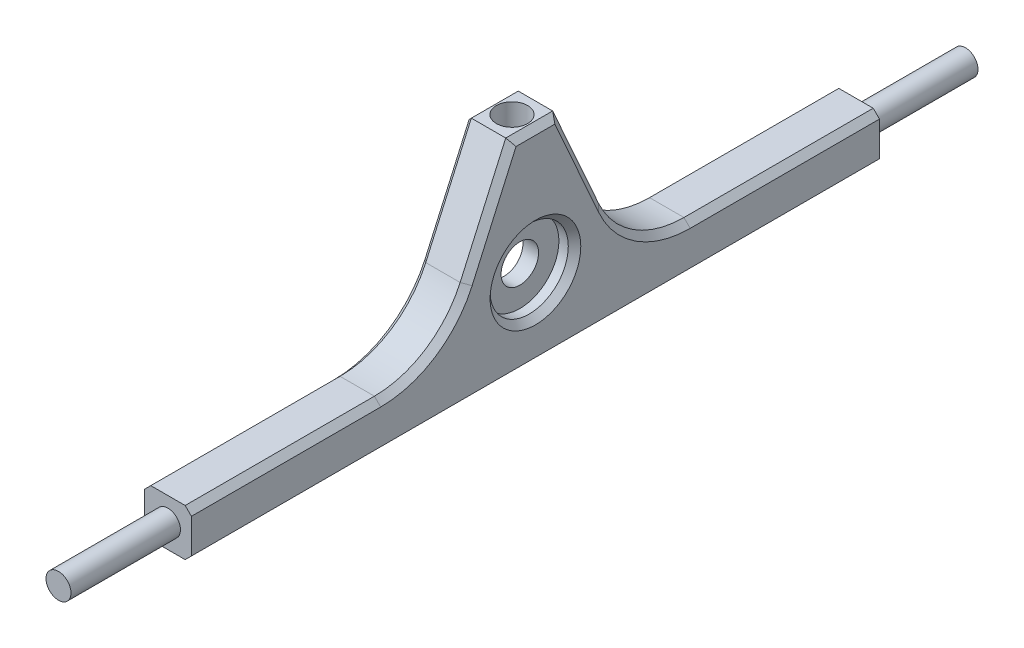
ISO-10303-21;
HEADER;
FILE_DESCRIPTION(('STEP AP214'),'2;1');
FILE_NAME('part.step','',(''),(''),'','','');
FILE_SCHEMA(('AUTOMOTIVE_DESIGN { 1 0 10303 214 1 1 1 1 }'));
ENDSEC;
DATA;
#1=APPLICATION_CONTEXT('core data for automotive mechanical design processes');
#2=APPLICATION_PROTOCOL_DEFINITION('international standard','automotive_design',2000,#1);
#3=PRODUCT_CONTEXT('',#1,'mechanical');
#4=PRODUCT('Part','Part','',(#3));
#5=PRODUCT_RELATED_PRODUCT_CATEGORY('part','',(#4));
#6=PRODUCT_DEFINITION_FORMATION('','',#4);
#7=PRODUCT_DEFINITION_CONTEXT('part definition',#1,'design');
#8=PRODUCT_DEFINITION('design','',#6,#7);
#9=PRODUCT_DEFINITION_SHAPE('','',#8);
#10=(LENGTH_UNIT() NAMED_UNIT(*) SI_UNIT(.MILLI.,.METRE.));
#11=(NAMED_UNIT(*) PLANE_ANGLE_UNIT() SI_UNIT($,.RADIAN.));
#12=(NAMED_UNIT(*) SI_UNIT($,.STERADIAN.) SOLID_ANGLE_UNIT());
#13=UNCERTAINTY_MEASURE_WITH_UNIT(LENGTH_MEASURE(1.E-05),#10,'distance_accuracy_value','');
#14=(GEOMETRIC_REPRESENTATION_CONTEXT(3) GLOBAL_UNCERTAINTY_ASSIGNED_CONTEXT((#13)) GLOBAL_UNIT_ASSIGNED_CONTEXT((#10,
#11,#12)) REPRESENTATION_CONTEXT('',''));
#15=CARTESIAN_POINT('',(0.,0.,0.));
#16=DIRECTION('',(0.,0.,1.));
#17=DIRECTION('',(1.,0.,0.));
#18=AXIS2_PLACEMENT_3D('',#15,#16,#17);
#19=CARTESIAN_POINT('',(-7.50005,18.,0.));
#20=DIRECTION('',(1.,0.,0.));
#21=DIRECTION('',(0.,0.,-1.));
#22=AXIS2_PLACEMENT_3D('',#19,#20,#21);
#23=CYLINDRICAL_SURFACE('',#22,6.);
#24=CARTESIAN_POINT('',(2.5,18.,0.));
#25=DIRECTION('',(1.,0.,0.));
#26=DIRECTION('',(0.,0.,-1.));
#27=AXIS2_PLACEMENT_3D('',#24,#25,#26);
#28=CIRCLE('',#27,6.);
#29=CARTESIAN_POINT('',(2.5,18.,-6.));
#30=VERTEX_POINT('',#29);
#31=EDGE_CURVE('E354',#30,#30,#28,.F.);
#32=ORIENTED_EDGE('',*,*,#31,.F.);
#33=EDGE_LOOP('',(#32));
#34=FACE_BOUND('',#33,.T.);
#35=CARTESIAN_POINT('',(-2.5,18.,0.));
#36=DIRECTION('',(-1.,0.,0.));
#37=DIRECTION('',(0.,0.,1.));
#38=AXIS2_PLACEMENT_3D('',#35,#36,#37);
#39=CIRCLE('',#38,6.);
#40=CARTESIAN_POINT('',(-2.5,18.,6.));
#41=VERTEX_POINT('',#40);
#42=EDGE_CURVE('E359',#41,#41,#39,.F.);
#43=ORIENTED_EDGE('',*,*,#42,.F.);
#44=EDGE_LOOP('',(#43));
#45=FACE_BOUND('',#44,.T.);
#46=ADVANCED_FACE('F45',(#34,#45),#23,.F.);
#47=CARTESIAN_POINT('',(-7.5,-7.5,-110.));
#48=DIRECTION('',(-1.,0.,0.));
#49=DIRECTION('',(0.,0.,1.));
#50=AXIS2_PLACEMENT_3D('',#47,#48,#49);
#51=PLANE('',#50);
#52=CARTESIAN_POINT('',(-7.5,18.,0.));
#53=DIRECTION('',(-1.,0.,0.));
#54=DIRECTION('',(0.,0.,1.));
#55=AXIS2_PLACEMENT_3D('',#52,#53,#54);
#56=CIRCLE('',#55,14.5);
#57=CARTESIAN_POINT('',(-7.5,18.,14.5));
#58=VERTEX_POINT('',#57);
#59=EDGE_CURVE('E236',#58,#58,#56,.F.);
#60=ORIENTED_EDGE('',*,*,#59,.T.);
#61=EDGE_LOOP('',(#60));
#62=FACE_BOUND('',#61,.T.);
#63=DIRECTION('',(0.,-1.,0.));
#64=VECTOR('',#63,1.);
#65=CARTESIAN_POINT('',(-7.5,-7.5,-110.));
#66=LINE('',#65,#64);
#67=CARTESIAN_POINT('',(-7.5,5.49999999999999,-110.));
#68=VERTEX_POINT('',#67);
#69=CARTESIAN_POINT('',(-7.5,-5.50000000000003,-110.));
#70=VERTEX_POINT('',#69);
#71=EDGE_CURVE('E331',#68,#70,#66,.T.);
#72=ORIENTED_EDGE('',*,*,#71,.T.);
#73=DIRECTION('',(0.,0.,1.));
#74=VECTOR('',#73,1.);
#75=CARTESIAN_POINT('',(-7.5,-5.50000000000003,-110.));
#76=LINE('',#75,#74);
#77=CARTESIAN_POINT('',(-7.5,-5.50000000000003,110.));
#78=VERTEX_POINT('',#77);
#79=EDGE_CURVE('E233',#70,#78,#76,.T.);
#80=ORIENTED_EDGE('',*,*,#79,.T.);
#81=DIRECTION('',(0.,-1.,0.));
#82=VECTOR('',#81,1.);
#83=CARTESIAN_POINT('',(-7.5,-7.5,110.));
#84=LINE('',#83,#82);
#85=CARTESIAN_POINT('',(-7.5,5.50000000000007,110.));
#86=VERTEX_POINT('',#85);
#87=EDGE_CURVE('E452',#86,#78,#84,.T.);
#88=ORIENTED_EDGE('',*,*,#87,.F.);
#89=DIRECTION('',(0.,0.,-1.));
#90=VECTOR('',#89,1.);
#91=CARTESIAN_POINT('',(-7.5,5.50000000000007,-110.));
#92=LINE('',#91,#90);
#93=CARTESIAN_POINT('',(-7.5,5.50000000000008,49.4766071291057));
#94=VERTEX_POINT('',#93);
#95=EDGE_CURVE('E231',#86,#94,#92,.T.);
#96=ORIENTED_EDGE('',*,*,#95,.T.);
#97=CARTESIAN_POINT('',(-7.5,37.5,49.4766071291057));
#98=DIRECTION('',(-1.,0.,0.));
#99=DIRECTION('',(0.,0.,1.));
#100=AXIS2_PLACEMENT_3D('',#97,#98,#99);
#101=CIRCLE('',#100,31.9999999999999);
#102=CARTESIAN_POINT('',(-7.5,24.4767224470878,20.246584177014));
#103=VERTEX_POINT('',#102);
#104=EDGE_CURVE('E229',#94,#103,#101,.F.);
#105=ORIENTED_EDGE('',*,*,#104,.T.);
#106=DIRECTION('',(0.,0.913438217252869,-0.406977423528506));
#107=VECTOR('',#106,1.);
#108=CARTESIAN_POINT('',(-7.5,46.2153270112777,10.5610672919789));
#109=LINE('',#108,#107);
#110=CARTESIAN_POINT('',(-7.5,56.,6.20155952472637));
#111=VERTEX_POINT('',#110);
#112=EDGE_CURVE('E227',#103,#111,#109,.T.);
#113=ORIENTED_EDGE('',*,*,#112,.T.);
#114=DIRECTION('',(0.,0.,-1.));
#115=VECTOR('',#114,1.);
#116=CARTESIAN_POINT('',(-7.5,56.,-110.));
#117=LINE('',#116,#115);
#118=CARTESIAN_POINT('',(-7.5,56.,-6.20155952472629));
#119=VERTEX_POINT('',#118);
#120=EDGE_CURVE('E225',#111,#119,#117,.T.);
#121=ORIENTED_EDGE('',*,*,#120,.T.);
#122=DIRECTION('',(0.,-0.913438217252869,-0.406977423528506));
#123=VECTOR('',#122,1.);
#124=CARTESIAN_POINT('',(-7.5,-35.569394074932,-46.999804409597));
#125=LINE('',#124,#123);
#126=CARTESIAN_POINT('',(-7.5,24.4767224470878,-20.2465841770139));
#127=VERTEX_POINT('',#126);
#128=EDGE_CURVE('E223',#119,#127,#125,.T.);
#129=ORIENTED_EDGE('',*,*,#128,.T.);
#130=CARTESIAN_POINT('',(-7.5,37.5,-49.4766071291057));
#131=DIRECTION('',(-1.,0.,0.));
#132=DIRECTION('',(0.,0.,1.));
#133=AXIS2_PLACEMENT_3D('',#130,#131,#132);
#134=CIRCLE('',#133,32.);
#135=CARTESIAN_POINT('',(-7.5,5.5,-49.4766071291057));
#136=VERTEX_POINT('',#135);
#137=EDGE_CURVE('E221',#127,#136,#134,.F.);
#138=ORIENTED_EDGE('',*,*,#137,.T.);
#139=DIRECTION('',(0.,0.,-1.));
#140=VECTOR('',#139,1.);
#141=CARTESIAN_POINT('',(-7.5,5.5,-110.));
#142=LINE('',#141,#140);
#143=EDGE_CURVE('E214',#136,#68,#142,.T.);
#144=ORIENTED_EDGE('',*,*,#143,.T.);
#145=EDGE_LOOP('',(#72,#80,#88,#96,#105,#113,#121,#129,#138,#144));
#146=FACE_BOUND('',#145,.T.);
#147=ADVANCED_FACE('F330',(#62,#146),#51,.T.);
#148=CARTESIAN_POINT('',(7.5,7.5,-110.));
#149=DIRECTION('',(0.,1.,0.));
#150=DIRECTION('',(-1.,0.,0.));
#151=AXIS2_PLACEMENT_3D('',#148,#149,#150);
#152=PLANE('',#151);
#153=DIRECTION('',(-1.,0.,0.));
#154=VECTOR('',#153,1.);
#155=CARTESIAN_POINT('',(7.5,7.5,-110.));
#156=LINE('',#155,#154);
#157=CARTESIAN_POINT('',(5.5,7.5,-110.));
#158=VERTEX_POINT('',#157);
#159=CARTESIAN_POINT('',(-5.50000000000002,7.5,-110.));
#160=VERTEX_POINT('',#159);
#161=EDGE_CURVE('E348',#158,#160,#156,.T.);
#162=ORIENTED_EDGE('',*,*,#161,.T.);
#163=DIRECTION('',(0.,0.,1.));
#164=VECTOR('',#163,1.);
#165=CARTESIAN_POINT('',(-5.50000000000003,7.5,-110.));
#166=LINE('',#165,#164);
#167=CARTESIAN_POINT('',(-5.50000000000003,7.5,-49.4766071291057));
#168=VERTEX_POINT('',#167);
#169=EDGE_CURVE('E11',#160,#168,#166,.T.);
#170=ORIENTED_EDGE('',*,*,#169,.T.);
#171=DIRECTION('',(1.,0.,0.));
#172=VECTOR('',#171,1.);
#173=CARTESIAN_POINT('',(7.5,7.5,-49.4766071291057));
#174=LINE('',#173,#172);
#175=CARTESIAN_POINT('',(5.5,7.5,-49.4766071291057));
#176=VERTEX_POINT('',#175);
#177=EDGE_CURVE('E353',#168,#176,#174,.T.);
#178=ORIENTED_EDGE('',*,*,#177,.T.);
#179=DIRECTION('',(0.,0.,-1.));
#180=VECTOR('',#179,1.);
#181=CARTESIAN_POINT('',(5.5,7.5,-110.));
#182=LINE('',#181,#180);
#183=EDGE_CURVE('E54',#176,#158,#182,.T.);
#184=ORIENTED_EDGE('',*,*,#183,.T.);
#185=EDGE_LOOP('',(#162,#170,#178,#184));
#186=FACE_BOUND('',#185,.T.);
#187=ADVANCED_FACE('F445',(#186),#152,.T.);
#188=CARTESIAN_POINT('',(0.,0.,-110.));
#189=DIRECTION('',(0.,0.,1.));
#190=DIRECTION('',(1.,0.,0.));
#191=AXIS2_PLACEMENT_3D('',#188,#189,#190);
#192=PLANE('',#191);
#193=DIRECTION('',(1.,0.,0.));
#194=VECTOR('',#193,1.);
#195=CARTESIAN_POINT('',(7.5,-7.5,-110.));
#196=LINE('',#195,#194);
#197=CARTESIAN_POINT('',(-5.5,-7.5,-110.));
#198=VERTEX_POINT('',#197);
#199=CARTESIAN_POINT('',(5.49999999999997,-7.5,-110.));
#200=VERTEX_POINT('',#199);
#201=EDGE_CURVE('E339',#198,#200,#196,.T.);
#202=ORIENTED_EDGE('',*,*,#201,.F.);
#203=DIRECTION('',(0.707106781186552,-0.707106781186543,0.));
#204=VECTOR('',#203,1.);
#205=CARTESIAN_POINT('',(-7.5,-5.50000000000003,-110.));
#206=LINE('',#205,#204);
#207=EDGE_CURVE('E260',#198,#70,#206,.F.);
#208=ORIENTED_EDGE('',*,*,#207,.T.);
#209=ORIENTED_EDGE('',*,*,#71,.F.);
#210=DIRECTION('',(-0.707106781186543,-0.707106781186552,0.));
#211=VECTOR('',#210,1.);
#212=CARTESIAN_POINT('',(-5.50000000000003,7.5,-110.));
#213=LINE('',#212,#211);
#214=EDGE_CURVE('E257',#68,#160,#213,.F.);
#215=ORIENTED_EDGE('',*,*,#214,.T.);
#216=ORIENTED_EDGE('',*,*,#161,.F.);
#217=DIRECTION('',(-0.707106781186553,0.707106781186542,0.));
#218=VECTOR('',#217,1.);
#219=CARTESIAN_POINT('',(7.5,5.50000000000003,-110.));
#220=LINE('',#219,#218);
#221=CARTESIAN_POINT('',(7.5,5.50000000000003,-110.));
#222=VERTEX_POINT('',#221);
#223=EDGE_CURVE('E255',#158,#222,#220,.F.);
#224=ORIENTED_EDGE('',*,*,#223,.T.);
#225=DIRECTION('',(0.,1.,0.));
#226=VECTOR('',#225,1.);
#227=CARTESIAN_POINT('',(7.5,-7.5,-110.));
#228=LINE('',#227,#226);
#229=CARTESIAN_POINT('',(7.5,-5.49999999999997,-110.));
#230=VERTEX_POINT('',#229);
#231=EDGE_CURVE('E342',#230,#222,#228,.T.);
#232=ORIENTED_EDGE('',*,*,#231,.F.);
#233=DIRECTION('',(0.707106781186548,0.707106781186548,0.));
#234=VECTOR('',#233,1.);
#235=CARTESIAN_POINT('',(5.49999999999997,-7.5,-110.));
#236=LINE('',#235,#234);
#237=EDGE_CURVE('E210',#230,#200,#236,.F.);
#238=ORIENTED_EDGE('',*,*,#237,.T.);
#239=EDGE_LOOP('',(#202,#208,#209,#215,#216,#224,#232,#238));
#240=FACE_BOUND('',#239,.T.);
#241=CARTESIAN_POINT('',(0.,0.,-110.));
#242=DIRECTION('',(0.,0.,1.));
#243=DIRECTION('',(1.,0.,0.));
#244=AXIS2_PLACEMENT_3D('',#241,#242,#243);
#245=CIRCLE('',#244,4.);
#246=CARTESIAN_POINT('',(4.,0.,-110.));
#247=VERTEX_POINT('',#246);
#248=EDGE_CURVE('E350',#247,#247,#245,.F.);
#249=ORIENTED_EDGE('',*,*,#248,.F.);
#250=EDGE_LOOP('',(#249));
#251=FACE_BOUND('',#250,.T.);
#252=ADVANCED_FACE('F335',(#240,#251),#192,.F.);
#253=CARTESIAN_POINT('',(0.,0.,110.));
#254=DIRECTION('',(0.,0.,1.));
#255=DIRECTION('',(1.,0.,0.));
#256=AXIS2_PLACEMENT_3D('',#253,#254,#255);
#257=PLANE('',#256);
#258=ORIENTED_EDGE('',*,*,#87,.T.);
#259=DIRECTION('',(-0.707106781186552,0.707106781186543,0.));
#260=VECTOR('',#259,1.);
#261=CARTESIAN_POINT('',(-6.49999999999996,-6.50000000000005,110.));
#262=LINE('',#261,#260);
#263=CARTESIAN_POINT('',(-5.5,-7.5,110.));
#264=VERTEX_POINT('',#263);
#265=EDGE_CURVE('E197',#78,#264,#262,.F.);
#266=ORIENTED_EDGE('',*,*,#265,.T.);
#267=DIRECTION('',(1.,0.,0.));
#268=VECTOR('',#267,1.);
#269=CARTESIAN_POINT('',(7.5,-7.5,110.));
#270=LINE('',#269,#268);
#271=CARTESIAN_POINT('',(5.49999999999997,-7.5,110.));
#272=VERTEX_POINT('',#271);
#273=EDGE_CURVE('E192',#264,#272,#270,.T.);
#274=ORIENTED_EDGE('',*,*,#273,.T.);
#275=DIRECTION('',(-0.707106781186548,-0.707106781186548,0.));
#276=VECTOR('',#275,1.);
#277=CARTESIAN_POINT('',(6.49999999999998,-6.49999999999998,110.));
#278=LINE('',#277,#276);
#279=CARTESIAN_POINT('',(7.5,-5.49999999999997,110.));
#280=VERTEX_POINT('',#279);
#281=EDGE_CURVE('E184',#272,#280,#278,.F.);
#282=ORIENTED_EDGE('',*,*,#281,.T.);
#283=DIRECTION('',(0.,1.,0.));
#284=VECTOR('',#283,1.);
#285=CARTESIAN_POINT('',(7.5,-7.5,110.));
#286=LINE('',#285,#284);
#287=CARTESIAN_POINT('',(7.5,5.50000000000016,110.));
#288=VERTEX_POINT('',#287);
#289=EDGE_CURVE('E189',#280,#288,#286,.T.);
#290=ORIENTED_EDGE('',*,*,#289,.T.);
#291=DIRECTION('',(0.707106781186547,-0.707106781186548,0.));
#292=VECTOR('',#291,1.);
#293=CARTESIAN_POINT('',(6.50000000000008,6.50000000000007,110.));
#294=LINE('',#293,#292);
#295=CARTESIAN_POINT('',(5.50000000000016,7.5,110.));
#296=VERTEX_POINT('',#295);
#297=EDGE_CURVE('E198',#288,#296,#294,.F.);
#298=ORIENTED_EDGE('',*,*,#297,.T.);
#299=DIRECTION('',(-1.,0.,0.));
#300=VECTOR('',#299,1.);
#301=CARTESIAN_POINT('',(7.5,7.5,110.));
#302=LINE('',#301,#300);
#303=CARTESIAN_POINT('',(-5.50000000000006,7.5,110.));
#304=VERTEX_POINT('',#303);
#305=EDGE_CURVE('E207',#296,#304,#302,.T.);
#306=ORIENTED_EDGE('',*,*,#305,.T.);
#307=DIRECTION('',(0.707106781186549,0.707106781186546,0.));
#308=VECTOR('',#307,1.);
#309=CARTESIAN_POINT('',(-6.50000000000002,6.50000000000005,110.));
#310=LINE('',#309,#308);
#311=EDGE_CURVE('E247',#304,#86,#310,.F.);
#312=ORIENTED_EDGE('',*,*,#311,.T.);
#313=EDGE_LOOP('',(#258,#266,#274,#282,#290,#298,#306,#312));
#314=FACE_BOUND('',#313,.T.);
#315=CARTESIAN_POINT('',(0.,0.,110.));
#316=DIRECTION('',(0.,0.,1.));
#317=DIRECTION('',(1.,0.,0.));
#318=AXIS2_PLACEMENT_3D('',#315,#316,#317);
#319=CIRCLE('',#318,4.);
#320=CARTESIAN_POINT('',(4.,0.,110.));
#321=VERTEX_POINT('',#320);
#322=EDGE_CURVE('E459',#321,#321,#319,.T.);
#323=ORIENTED_EDGE('',*,*,#322,.F.);
#324=EDGE_LOOP('',(#323));
#325=FACE_BOUND('',#324,.T.);
#326=ADVANCED_FACE('F187',(#314,#325),#257,.T.);
#327=ORIENTED_EDGE('',*,*,#305,.F.);
#328=DIRECTION('',(0.,0.,-1.));
#329=VECTOR('',#328,1.);
#330=CARTESIAN_POINT('',(5.50000000000016,7.5,-110.));
#331=LINE('',#330,#329);
#332=CARTESIAN_POINT('',(5.50000000000016,7.5,49.4766071291057));
#333=VERTEX_POINT('',#332);
#334=EDGE_CURVE('E268',#296,#333,#331,.T.);
#335=ORIENTED_EDGE('',*,*,#334,.T.);
#336=DIRECTION('',(1.,0.,0.));
#337=VECTOR('',#336,1.);
#338=CARTESIAN_POINT('',(-7.5,7.5,49.4766071291057));
#339=LINE('',#338,#337);
#340=CARTESIAN_POINT('',(-5.50000000000006,7.5,49.4766071291057));
#341=VERTEX_POINT('',#340);
#342=EDGE_CURVE('E369',#333,#341,#339,.F.);
#343=ORIENTED_EDGE('',*,*,#342,.T.);
#344=DIRECTION('',(0.,0.,1.));
#345=VECTOR('',#344,1.);
#346=CARTESIAN_POINT('',(-5.50000000000006,7.5,-110.));
#347=LINE('',#346,#345);
#348=EDGE_CURVE('E266',#341,#304,#347,.T.);
#349=ORIENTED_EDGE('',*,*,#348,.T.);
#350=EDGE_LOOP('',(#327,#335,#343,#349));
#351=FACE_BOUND('',#350,.T.);
#352=ADVANCED_FACE('F527',(#351),#152,.T.);
#353=CARTESIAN_POINT('',(7.5,-7.5,-110.));
#354=DIRECTION('',(1.,0.,0.));
#355=DIRECTION('',(0.,0.,-1.));
#356=AXIS2_PLACEMENT_3D('',#353,#354,#355);
#357=PLANE('',#356);
#358=CARTESIAN_POINT('',(7.5,18.,0.));
#359=DIRECTION('',(1.,0.,0.));
#360=DIRECTION('',(0.,0.,-1.));
#361=AXIS2_PLACEMENT_3D('',#358,#359,#360);
#362=CIRCLE('',#361,14.5000000000001);
#363=CARTESIAN_POINT('',(7.5,18.,-14.5000000000001));
#364=VERTEX_POINT('',#363);
#365=EDGE_CURVE('E211',#364,#364,#362,.F.);
#366=ORIENTED_EDGE('',*,*,#365,.T.);
#367=EDGE_LOOP('',(#366));
#368=FACE_BOUND('',#367,.T.);
#369=ORIENTED_EDGE('',*,*,#289,.F.);
#370=DIRECTION('',(0.,0.,-1.));
#371=VECTOR('',#370,1.);
#372=CARTESIAN_POINT('',(7.5,-5.49999999999997,-110.));
#373=LINE('',#372,#371);
#374=EDGE_CURVE('E203',#280,#230,#373,.T.);
#375=ORIENTED_EDGE('',*,*,#374,.T.);
#376=ORIENTED_EDGE('',*,*,#231,.T.);
#377=DIRECTION('',(0.,0.,1.));
#378=VECTOR('',#377,1.);
#379=CARTESIAN_POINT('',(7.5,5.50000000000003,-110.));
#380=LINE('',#379,#378);
#381=CARTESIAN_POINT('',(7.5,5.50000000000003,-49.4766071291057));
#382=VERTEX_POINT('',#381);
#383=EDGE_CURVE('E375',#222,#382,#380,.T.);
#384=ORIENTED_EDGE('',*,*,#383,.T.);
#385=CARTESIAN_POINT('',(7.5,37.5,-49.4766071291057));
#386=DIRECTION('',(1.,0.,0.));
#387=DIRECTION('',(0.,0.,-1.));
#388=AXIS2_PLACEMENT_3D('',#385,#386,#387);
#389=CIRCLE('',#388,32.);
#390=CARTESIAN_POINT('',(7.5,24.4767224470878,-20.2465841770139));
#391=VERTEX_POINT('',#390);
#392=EDGE_CURVE('E377',#382,#391,#389,.F.);
#393=ORIENTED_EDGE('',*,*,#392,.T.);
#394=DIRECTION('',(0.,0.913438217252869,0.406977423528506));
#395=VECTOR('',#394,1.);
#396=CARTESIAN_POINT('',(7.5,-35.569394074932,-46.999804409597));
#397=LINE('',#396,#395);
#398=CARTESIAN_POINT('',(7.5,56.,-6.20155952472629));
#399=VERTEX_POINT('',#398);
#400=EDGE_CURVE('E379',#391,#399,#397,.T.);
#401=ORIENTED_EDGE('',*,*,#400,.T.);
#402=DIRECTION('',(0.,0.,1.));
#403=VECTOR('',#402,1.);
#404=CARTESIAN_POINT('',(7.5,56.,-110.));
#405=LINE('',#404,#403);
#406=CARTESIAN_POINT('',(7.5,56.,6.20155952472646));
#407=VERTEX_POINT('',#406);
#408=EDGE_CURVE('E381',#399,#407,#405,.T.);
#409=ORIENTED_EDGE('',*,*,#408,.T.);
#410=DIRECTION('',(0.,-0.913438217252869,0.406977423528506));
#411=VECTOR('',#410,1.);
#412=CARTESIAN_POINT('',(7.5,46.2153270112777,10.5610672919789));
#413=LINE('',#412,#411);
#414=CARTESIAN_POINT('',(7.5,24.4767224470879,20.246584177014));
#415=VERTEX_POINT('',#414);
#416=EDGE_CURVE('E384',#407,#415,#413,.T.);
#417=ORIENTED_EDGE('',*,*,#416,.T.);
#418=CARTESIAN_POINT('',(7.5,37.5,49.4766071291057));
#419=DIRECTION('',(1.,0.,0.));
#420=DIRECTION('',(0.,0.,-1.));
#421=AXIS2_PLACEMENT_3D('',#418,#419,#420);
#422=CIRCLE('',#421,31.9999999999998);
#423=CARTESIAN_POINT('',(7.5,5.50000000000016,49.4766071291057));
#424=VERTEX_POINT('',#423);
#425=EDGE_CURVE('E216',#415,#424,#422,.F.);
#426=ORIENTED_EDGE('',*,*,#425,.T.);
#427=DIRECTION('',(0.,0.,1.));
#428=VECTOR('',#427,1.);
#429=CARTESIAN_POINT('',(7.5,5.50000000000016,-110.));
#430=LINE('',#429,#428);
#431=EDGE_CURVE('E206',#424,#288,#430,.T.);
#432=ORIENTED_EDGE('',*,*,#431,.T.);
#433=EDGE_LOOP('',(#369,#375,#376,#384,#393,#401,#409,#417,#426,#432));
#434=FACE_BOUND('',#433,.T.);
#435=ADVANCED_FACE('F201',(#368,#434),#357,.T.);
#436=CARTESIAN_POINT('',(7.5,-7.5,-110.));
#437=DIRECTION('',(0.,-1.,0.));
#438=DIRECTION('',(1.,0.,0.));
#439=AXIS2_PLACEMENT_3D('',#436,#437,#438);
#440=PLANE('',#439);
#441=ORIENTED_EDGE('',*,*,#273,.F.);
#442=DIRECTION('',(0.,0.,-1.));
#443=VECTOR('',#442,1.);
#444=CARTESIAN_POINT('',(-5.5,-7.5,-110.));
#445=LINE('',#444,#443);
#446=EDGE_CURVE('E253',#264,#198,#445,.T.);
#447=ORIENTED_EDGE('',*,*,#446,.T.);
#448=ORIENTED_EDGE('',*,*,#201,.T.);
#449=DIRECTION('',(0.,0.,1.));
#450=VECTOR('',#449,1.);
#451=CARTESIAN_POINT('',(5.49999999999997,-7.5,-110.));
#452=LINE('',#451,#450);
#453=EDGE_CURVE('E251',#200,#272,#452,.T.);
#454=ORIENTED_EDGE('',*,*,#453,.T.);
#455=EDGE_LOOP('',(#441,#447,#448,#454));
#456=FACE_BOUND('',#455,.T.);
#457=ADVANCED_FACE('F447',(#456),#440,.T.);
#458=CARTESIAN_POINT('',(0.,0.,145.));
#459=DIRECTION('',(0.,0.,-1.));
#460=DIRECTION('',(-1.,0.,0.));
#461=AXIS2_PLACEMENT_3D('',#458,#459,#460);
#462=CYLINDRICAL_SURFACE('',#461,4.);
#463=CARTESIAN_POINT('',(0.,0.,145.));
#464=DIRECTION('',(0.,0.,1.));
#465=DIRECTION('',(1.,0.,0.));
#466=AXIS2_PLACEMENT_3D('',#463,#464,#465);
#467=CIRCLE('',#466,4.);
#468=CARTESIAN_POINT('',(4.,0.,145.));
#469=VERTEX_POINT('',#468);
#470=EDGE_CURVE('E455',#469,#469,#467,.T.);
#471=ORIENTED_EDGE('',*,*,#470,.F.);
#472=EDGE_LOOP('',(#471));
#473=FACE_BOUND('',#472,.T.);
#474=ORIENTED_EDGE('',*,*,#322,.T.);
#475=EDGE_LOOP('',(#474));
#476=FACE_BOUND('',#475,.T.);
#477=ADVANCED_FACE('F520',(#473,#476),#462,.T.);
#478=CARTESIAN_POINT('',(0.,0.,145.));
#479=DIRECTION('',(0.,0.,1.));
#480=DIRECTION('',(1.,0.,0.));
#481=AXIS2_PLACEMENT_3D('',#478,#479,#480);
#482=PLANE('',#481);
#483=ORIENTED_EDGE('',*,*,#470,.T.);
#484=EDGE_LOOP('',(#483));
#485=FACE_BOUND('',#484,.T.);
#486=ADVANCED_FACE('F516',(#485),#482,.T.);
#487=CARTESIAN_POINT('',(0.,0.,-145.));
#488=DIRECTION('',(0.,0.,1.));
#489=DIRECTION('',(1.,0.,0.));
#490=AXIS2_PLACEMENT_3D('',#487,#488,#489);
#491=CYLINDRICAL_SURFACE('',#490,4.);
#492=CARTESIAN_POINT('',(0.,0.,-145.));
#493=DIRECTION('',(0.,0.,-1.));
#494=DIRECTION('',(-1.,0.,0.));
#495=AXIS2_PLACEMENT_3D('',#492,#493,#494);
#496=CIRCLE('',#495,4.);
#497=CARTESIAN_POINT('',(-4.,0.,-145.));
#498=VERTEX_POINT('',#497);
#499=EDGE_CURVE('E463',#498,#498,#496,.T.);
#500=ORIENTED_EDGE('',*,*,#499,.F.);
#501=EDGE_LOOP('',(#500));
#502=FACE_BOUND('',#501,.T.);
#503=ORIENTED_EDGE('',*,*,#248,.T.);
#504=EDGE_LOOP('',(#503));
#505=FACE_BOUND('',#504,.T.);
#506=ADVANCED_FACE('F512',(#502,#505),#491,.T.);
#507=CARTESIAN_POINT('',(0.,0.,-145.));
#508=DIRECTION('',(0.,0.,-1.));
#509=DIRECTION('',(-1.,0.,0.));
#510=AXIS2_PLACEMENT_3D('',#507,#508,#509);
#511=PLANE('',#510);
#512=ORIENTED_EDGE('',*,*,#499,.T.);
#513=EDGE_LOOP('',(#512));
#514=FACE_BOUND('',#513,.T.);
#515=ADVANCED_FACE('F504',(#514),#511,.T.);
#516=CARTESIAN_POINT('',(-7.5,7.50000000000001,30.));
#517=DIRECTION('',(0.,0.406977423528506,0.913438217252869));
#518=DIRECTION('',(0.,-0.913438217252869,0.406977423528506));
#519=AXIS2_PLACEMENT_3D('',#516,#517,#518);
#520=PLANE('',#519);
#521=DIRECTION('',(1.,0.,0.));
#522=VECTOR('',#521,1.);
#523=CARTESIAN_POINT('',(7.5,25.2906772941448,22.0734606115196));
#524=LINE('',#523,#522);
#525=CARTESIAN_POINT('',(-5.50000000000006,25.2906772941448,22.0734606115196));
#526=VERTEX_POINT('',#525);
#527=CARTESIAN_POINT('',(5.50000000000016,25.2906772941448,22.0734606115196));
#528=VERTEX_POINT('',#527);
#529=EDGE_CURVE('E366',#526,#528,#524,.T.);
#530=ORIENTED_EDGE('',*,*,#529,.T.);
#531=DIRECTION('',(0.,0.913438217252869,-0.406977423528506));
#532=VECTOR('',#531,1.);
#533=CARTESIAN_POINT('',(5.50000000000015,7.50000000000001,30.));
#534=LINE('',#533,#532);
#535=CARTESIAN_POINT('',(5.50000000000015,58.,7.5));
#536=VERTEX_POINT('',#535);
#537=EDGE_CURVE('E264',#528,#536,#534,.T.);
#538=ORIENTED_EDGE('',*,*,#537,.T.);
#539=DIRECTION('',(1.,0.,0.));
#540=VECTOR('',#539,1.);
#541=CARTESIAN_POINT('',(-7.5,58.,7.5));
#542=LINE('',#541,#540);
#543=CARTESIAN_POINT('',(-5.50000000000006,58.,7.5));
#544=VERTEX_POINT('',#543);
#545=EDGE_CURVE('E405',#544,#536,#542,.T.);
#546=ORIENTED_EDGE('',*,*,#545,.F.);
#547=DIRECTION('',(0.,-0.913438217252869,0.406977423528506));
#548=VECTOR('',#547,1.);
#549=CARTESIAN_POINT('',(-5.50000000000006,7.50000000000001,30.));
#550=LINE('',#549,#548);
#551=EDGE_CURVE('E262',#544,#526,#550,.T.);
#552=ORIENTED_EDGE('',*,*,#551,.T.);
#553=EDGE_LOOP('',(#530,#538,#546,#552));
#554=FACE_BOUND('',#553,.T.);
#555=ADVANCED_FACE('F401',(#554),#520,.T.);
#556=CARTESIAN_POINT('',(-7.5,58.,7.5));
#557=DIRECTION('',(0.,1.,0.));
#558=DIRECTION('',(0.,0.,1.));
#559=AXIS2_PLACEMENT_3D('',#556,#557,#558);
#560=PLANE('',#559);
#561=CARTESIAN_POINT('',(0.,58.,0.));
#562=DIRECTION('',(0.,1.,0.));
#563=DIRECTION('',(0.,0.,1.));
#564=AXIS2_PLACEMENT_3D('',#561,#562,#563);
#565=CIRCLE('',#564,5.);
#566=CARTESIAN_POINT('',(0.,58.,5.));
#567=VERTEX_POINT('',#566);
#568=EDGE_CURVE('E357',#567,#567,#565,.T.);
#569=ORIENTED_EDGE('',*,*,#568,.F.);
#570=EDGE_LOOP('',(#569));
#571=FACE_BOUND('',#570,.T.);
#572=ORIENTED_EDGE('',*,*,#545,.T.);
#573=DIRECTION('',(0.,0.,-1.));
#574=VECTOR('',#573,1.);
#575=CARTESIAN_POINT('',(5.5,58.,7.5));
#576=LINE('',#575,#574);
#577=CARTESIAN_POINT('',(5.5,58.,-7.5));
#578=VERTEX_POINT('',#577);
#579=EDGE_CURVE('E245',#536,#578,#576,.T.);
#580=ORIENTED_EDGE('',*,*,#579,.T.);
#581=DIRECTION('',(1.,0.,0.));
#582=VECTOR('',#581,1.);
#583=CARTESIAN_POINT('',(-7.5,58.,-7.5));
#584=LINE('',#583,#582);
#585=CARTESIAN_POINT('',(-5.50000000000003,58.,-7.5));
#586=VERTEX_POINT('',#585);
#587=EDGE_CURVE('E417',#586,#578,#584,.T.);
#588=ORIENTED_EDGE('',*,*,#587,.F.);
#589=DIRECTION('',(0.,0.,1.));
#590=VECTOR('',#589,1.);
#591=CARTESIAN_POINT('',(-5.50000000000003,58.,7.5));
#592=LINE('',#591,#590);
#593=EDGE_CURVE('E242',#586,#544,#592,.T.);
#594=ORIENTED_EDGE('',*,*,#593,.T.);
#595=EDGE_LOOP('',(#572,#580,#588,#594));
#596=FACE_BOUND('',#595,.T.);
#597=ADVANCED_FACE('F414',(#571,#596),#560,.T.);
#598=CARTESIAN_POINT('',(-7.5,58.,-7.5));
#599=DIRECTION('',(0.,0.406977423528506,-0.913438217252869));
#600=DIRECTION('',(0.,0.913438217252869,0.406977423528506));
#601=AXIS2_PLACEMENT_3D('',#598,#599,#600);
#602=PLANE('',#601);
#603=DIRECTION('',(1.,0.,0.));
#604=VECTOR('',#603,1.);
#605=CARTESIAN_POINT('',(-7.5,25.2906772941448,-22.0734606115196));
#606=LINE('',#605,#604);
#607=CARTESIAN_POINT('',(5.5,25.2906772941448,-22.0734606115196));
#608=VERTEX_POINT('',#607);
#609=CARTESIAN_POINT('',(-5.50000000000003,25.2906772941448,-22.0734606115196));
#610=VERTEX_POINT('',#609);
#611=EDGE_CURVE('E363',#608,#610,#606,.F.);
#612=ORIENTED_EDGE('',*,*,#611,.T.);
#613=DIRECTION('',(0.,0.913438217252869,0.406977423528506));
#614=VECTOR('',#613,1.);
#615=CARTESIAN_POINT('',(-5.50000000000003,58.,-7.5));
#616=LINE('',#615,#614);
#617=EDGE_CURVE('E276',#610,#586,#616,.T.);
#618=ORIENTED_EDGE('',*,*,#617,.T.);
#619=ORIENTED_EDGE('',*,*,#587,.T.);
#620=DIRECTION('',(0.,-0.913438217252869,-0.406977423528506));
#621=VECTOR('',#620,1.);
#622=CARTESIAN_POINT('',(5.5,58.,-7.5));
#623=LINE('',#622,#621);
#624=EDGE_CURVE('E274',#578,#608,#623,.T.);
#625=ORIENTED_EDGE('',*,*,#624,.T.);
#626=EDGE_LOOP('',(#612,#618,#619,#625));
#627=FACE_BOUND('',#626,.T.);
#628=ADVANCED_FACE('F427',(#627),#602,.T.);
#629=CARTESIAN_POINT('',(0.,38.,0.));
#630=DIRECTION('',(0.,1.,0.));
#631=DIRECTION('',(0.,0.,1.));
#632=AXIS2_PLACEMENT_3D('',#629,#630,#631);
#633=CYLINDRICAL_SURFACE('',#632,5.);
#634=CARTESIAN_POINT('',(0.,38.,0.));
#635=DIRECTION('',(0.,1.,0.));
#636=DIRECTION('',(0.,0.,1.));
#637=AXIS2_PLACEMENT_3D('',#634,#635,#636);
#638=CIRCLE('',#637,5.);
#639=CARTESIAN_POINT('',(0.,38.,5.));
#640=VERTEX_POINT('',#639);
#641=EDGE_CURVE('E468',#640,#640,#638,.T.);
#642=ORIENTED_EDGE('',*,*,#641,.F.);
#643=EDGE_LOOP('',(#642));
#644=FACE_BOUND('',#643,.T.);
#645=ORIENTED_EDGE('',*,*,#568,.T.);
#646=EDGE_LOOP('',(#645));
#647=FACE_BOUND('',#646,.T.);
#648=ADVANCED_FACE('F500',(#644,#647),#633,.F.);
#649=CARTESIAN_POINT('',(0.,38.,0.));
#650=DIRECTION('',(0.,1.,0.));
#651=DIRECTION('',(0.,0.,1.));
#652=AXIS2_PLACEMENT_3D('',#649,#650,#651);
#653=PLANE('',#652);
#654=ORIENTED_EDGE('',*,*,#641,.T.);
#655=EDGE_LOOP('',(#654));
#656=FACE_BOUND('',#655,.T.);
#657=ADVANCED_FACE('F741',(#656),#653,.T.);
#658=CARTESIAN_POINT('',(2.5,18.,0.));
#659=DIRECTION('',(1.,0.,0.));
#660=DIRECTION('',(0.,0.,-1.));
#661=AXIS2_PLACEMENT_3D('',#658,#659,#660);
#662=PLANE('',#661);
#663=CARTESIAN_POINT('',(2.5,18.,0.));
#664=DIRECTION('',(1.,0.,0.));
#665=DIRECTION('',(0.,0.,-1.));
#666=AXIS2_PLACEMENT_3D('',#663,#664,#665);
#667=CIRCLE('',#666,12.5);
#668=CARTESIAN_POINT('',(2.5,18.,-12.5));
#669=VERTEX_POINT('',#668);
#670=EDGE_CURVE('E358',#669,#669,#667,.T.);
#671=ORIENTED_EDGE('',*,*,#670,.T.);
#672=EDGE_LOOP('',(#671));
#673=FACE_BOUND('',#672,.T.);
#674=ORIENTED_EDGE('',*,*,#31,.T.);
#675=EDGE_LOOP('',(#674));
#676=FACE_BOUND('',#675,.T.);
#677=ADVANCED_FACE('F732',(#673,#676),#662,.T.);
#678=CARTESIAN_POINT('',(2.5,18.,0.));
#679=DIRECTION('',(1.,0.,0.));
#680=DIRECTION('',(0.,0.,-1.));
#681=AXIS2_PLACEMENT_3D('',#678,#679,#680);
#682=CYLINDRICAL_SURFACE('',#681,12.5);
#683=CARTESIAN_POINT('',(5.49999999999992,18.,0.));
#684=DIRECTION('',(1.,0.,0.));
#685=DIRECTION('',(0.,0.,-1.));
#686=AXIS2_PLACEMENT_3D('',#683,#684,#685);
#687=CIRCLE('',#686,12.5);
#688=CARTESIAN_POINT('',(5.49999999999992,18.,-12.5));
#689=VERTEX_POINT('',#688);
#690=EDGE_CURVE('E372',#689,#689,#687,.T.);
#691=ORIENTED_EDGE('',*,*,#690,.T.);
#692=EDGE_LOOP('',(#691));
#693=FACE_BOUND('',#692,.T.);
#694=ORIENTED_EDGE('',*,*,#670,.F.);
#695=EDGE_LOOP('',(#694));
#696=FACE_BOUND('',#695,.T.);
#697=ADVANCED_FACE('F484',(#693,#696),#682,.F.);
#698=CARTESIAN_POINT('',(-2.5,18.,0.));
#699=DIRECTION('',(-1.,0.,0.));
#700=DIRECTION('',(0.,0.,-1.));
#701=AXIS2_PLACEMENT_3D('',#698,#699,#700);
#702=PLANE('',#701);
#703=CARTESIAN_POINT('',(-2.5,18.,0.));
#704=DIRECTION('',(1.,0.,0.));
#705=DIRECTION('',(0.,0.,-1.));
#706=AXIS2_PLACEMENT_3D('',#703,#704,#705);
#707=CIRCLE('',#706,12.5);
#708=CARTESIAN_POINT('',(-2.5,18.,-12.5));
#709=VERTEX_POINT('',#708);
#710=EDGE_CURVE('E299',#709,#709,#707,.T.);
#711=ORIENTED_EDGE('',*,*,#710,.F.);
#712=EDGE_LOOP('',(#711));
#713=FACE_BOUND('',#712,.T.);
#714=ORIENTED_EDGE('',*,*,#42,.T.);
#715=EDGE_LOOP('',(#714));
#716=FACE_BOUND('',#715,.T.);
#717=ADVANCED_FACE('F481',(#713,#716),#702,.T.);
#718=CARTESIAN_POINT('',(-2.5,18.,0.));
#719=DIRECTION('',(-1.,0.,0.));
#720=DIRECTION('',(0.,0.,1.));
#721=AXIS2_PLACEMENT_3D('',#718,#719,#720);
#722=CYLINDRICAL_SURFACE('',#721,12.5);
#723=CARTESIAN_POINT('',(-5.5,18.,0.));
#724=DIRECTION('',(-1.,0.,0.));
#725=DIRECTION('',(0.,0.,1.));
#726=AXIS2_PLACEMENT_3D('',#723,#724,#725);
#727=CIRCLE('',#726,12.5);
#728=CARTESIAN_POINT('',(-5.5,18.,12.5));
#729=VERTEX_POINT('',#728);
#730=EDGE_CURVE('E239',#729,#729,#727,.T.);
#731=ORIENTED_EDGE('',*,*,#730,.T.);
#732=EDGE_LOOP('',(#731));
#733=FACE_BOUND('',#732,.T.);
#734=ORIENTED_EDGE('',*,*,#710,.T.);
#735=EDGE_LOOP('',(#734));
#736=FACE_BOUND('',#735,.T.);
#737=ADVANCED_FACE('F479',(#733,#736),#722,.F.);
#738=CARTESIAN_POINT('',(7.49999999999999,37.5,-49.4766071291057));
#739=DIRECTION('',(-1.,0.,0.));
#740=DIRECTION('',(0.,-1.,0.));
#741=AXIS2_PLACEMENT_3D('',#738,#739,#740);
#742=CYLINDRICAL_SURFACE('',#741,30.);
#743=ORIENTED_EDGE('',*,*,#177,.F.);
#744=CARTESIAN_POINT('',(-5.50000000000003,37.5,-49.4766071291057));
#745=DIRECTION('',(-1.,0.,0.));
#746=DIRECTION('',(0.,0.,1.));
#747=AXIS2_PLACEMENT_3D('',#744,#745,#746);
#748=CIRCLE('',#747,30.);
#749=EDGE_CURVE('E279',#168,#610,#748,.T.);
#750=ORIENTED_EDGE('',*,*,#749,.T.);
#751=ORIENTED_EDGE('',*,*,#611,.F.);
#752=CARTESIAN_POINT('',(5.5,37.5,-49.4766071291057));
#753=DIRECTION('',(1.,0.,0.));
#754=DIRECTION('',(0.,0.,-1.));
#755=AXIS2_PLACEMENT_3D('',#752,#753,#754);
#756=CIRCLE('',#755,30.);
#757=EDGE_CURVE('E62',#608,#176,#756,.T.);
#758=ORIENTED_EDGE('',*,*,#757,.T.);
#759=EDGE_LOOP('',(#743,#750,#751,#758));
#760=FACE_BOUND('',#759,.T.);
#761=ADVANCED_FACE('F429',(#760),#742,.F.);
#762=CARTESIAN_POINT('',(-7.5,37.5,49.4766071291057));
#763=DIRECTION('',(-1.,0.,0.));
#764=DIRECTION('',(0.,-1.,0.));
#765=AXIS2_PLACEMENT_3D('',#762,#763,#764);
#766=CYLINDRICAL_SURFACE('',#765,30.);
#767=ORIENTED_EDGE('',*,*,#342,.F.);
#768=CARTESIAN_POINT('',(5.50000000000016,37.5,49.4766071291057));
#769=DIRECTION('',(1.,0.,0.));
#770=DIRECTION('',(0.,0.,-1.));
#771=AXIS2_PLACEMENT_3D('',#768,#769,#770);
#772=CIRCLE('',#771,30.);
#773=EDGE_CURVE('E272',#333,#528,#772,.T.);
#774=ORIENTED_EDGE('',*,*,#773,.T.);
#775=ORIENTED_EDGE('',*,*,#529,.F.);
#776=CARTESIAN_POINT('',(-5.50000000000006,37.5,49.4766071291057));
#777=DIRECTION('',(-1.,0.,0.));
#778=DIRECTION('',(0.,0.,1.));
#779=AXIS2_PLACEMENT_3D('',#776,#777,#778);
#780=CIRCLE('',#779,30.);
#781=EDGE_CURVE('E270',#526,#341,#780,.T.);
#782=ORIENTED_EDGE('',*,*,#781,.T.);
#783=EDGE_LOOP('',(#767,#774,#775,#782));
#784=FACE_BOUND('',#783,.T.);
#785=ADVANCED_FACE('F399',(#784),#766,.F.);
#786=CARTESIAN_POINT('',(5.49999999999992,18.,0.));
#787=DIRECTION('',(1.,0.,0.));
#788=DIRECTION('',(0.,0.,-1.));
#789=AXIS2_PLACEMENT_3D('',#786,#787,#788);
#790=CONICAL_SURFACE('',#789,12.5,0.785398163397444);
#791=ORIENTED_EDGE('',*,*,#365,.F.);
#792=EDGE_LOOP('',(#791));
#793=FACE_BOUND('',#792,.T.);
#794=ORIENTED_EDGE('',*,*,#690,.F.);
#795=EDGE_LOOP('',(#794));
#796=FACE_BOUND('',#795,.T.);
#797=ADVANCED_FACE('F542',(#793,#796),#790,.F.);
#798=CARTESIAN_POINT('',(-7.5,18.,0.));
#799=DIRECTION('',(-1.,0.,0.));
#800=DIRECTION('',(0.,0.,1.));
#801=AXIS2_PLACEMENT_3D('',#798,#799,#800);
#802=CONICAL_SURFACE('',#801,14.5,0.785398163397445);
#803=ORIENTED_EDGE('',*,*,#730,.F.);
#804=EDGE_LOOP('',(#803));
#805=FACE_BOUND('',#804,.T.);
#806=ORIENTED_EDGE('',*,*,#59,.F.);
#807=EDGE_LOOP('',(#806));
#808=FACE_BOUND('',#807,.T.);
#809=ADVANCED_FACE('F545',(#805,#808),#802,.F.);
#810=CARTESIAN_POINT('',(7.5,5.50000000000003,-110.));
#811=DIRECTION('',(-0.707106781186542,-0.707106781186553,0.));
#812=DIRECTION('',(0.,0.,1.));
#813=AXIS2_PLACEMENT_3D('',#810,#811,#812);
#814=PLANE('',#813);
#815=ORIENTED_EDGE('',*,*,#223,.F.);
#816=ORIENTED_EDGE('',*,*,#183,.F.);
#817=DIRECTION('',(-0.707106781186553,0.707106781186542,0.));
#818=VECTOR('',#817,1.);
#819=CARTESIAN_POINT('',(7.5,5.50000000000003,-49.4766071291057));
#820=LINE('',#819,#818);
#821=EDGE_CURVE('E296',#382,#176,#820,.T.);
#822=ORIENTED_EDGE('',*,*,#821,.F.);
#823=ORIENTED_EDGE('',*,*,#383,.F.);
#824=EDGE_LOOP('',(#815,#816,#822,#823));
#825=FACE_BOUND('',#824,.T.);
#826=ADVANCED_FACE('F444',(#825),#814,.F.);
#827=CARTESIAN_POINT('',(7.5,5.50000000000016,-110.));
#828=DIRECTION('',(-0.707106781186548,-0.707106781186547,0.));
#829=DIRECTION('',(0.,0.,1.));
#830=AXIS2_PLACEMENT_3D('',#827,#828,#829);
#831=PLANE('',#830);
#832=ORIENTED_EDGE('',*,*,#297,.F.);
#833=ORIENTED_EDGE('',*,*,#431,.F.);
#834=DIRECTION('',(0.707106781186547,-0.707106781186548,0.));
#835=VECTOR('',#834,1.);
#836=CARTESIAN_POINT('',(5.50000000000016,7.5,49.4766071291057));
#837=LINE('',#836,#835);
#838=EDGE_CURVE('E293',#333,#424,#837,.T.);
#839=ORIENTED_EDGE('',*,*,#838,.F.);
#840=ORIENTED_EDGE('',*,*,#334,.F.);
#841=EDGE_LOOP('',(#832,#833,#839,#840));
#842=FACE_BOUND('',#841,.T.);
#843=ADVANCED_FACE('F391',(#842),#831,.F.);
#844=CARTESIAN_POINT('',(7.5,37.5,-49.4766071291057));
#845=DIRECTION('',(1.,0.,0.));
#846=DIRECTION('',(0.,0.,-1.));
#847=AXIS2_PLACEMENT_3D('',#844,#845,#846);
#848=CONICAL_SURFACE('',#847,32.,0.785398163397441);
#849=ORIENTED_EDGE('',*,*,#821,.T.);
#850=ORIENTED_EDGE('',*,*,#757,.F.);
#851=DIRECTION('',(-0.707106781186551,0.287776495966836,-0.64589835761445));
#852=VECTOR('',#851,1.);
#853=CARTESIAN_POINT('',(7.5,24.4767224470878,-20.2465841770139));
#854=LINE('',#853,#852);
#855=EDGE_CURVE('E290',#391,#608,#854,.T.);
#856=ORIENTED_EDGE('',*,*,#855,.F.);
#857=ORIENTED_EDGE('',*,*,#392,.F.);
#858=EDGE_LOOP('',(#849,#850,#856,#857));
#859=FACE_BOUND('',#858,.T.);
#860=ADVANCED_FACE('F432',(#859),#848,.F.);
#861=CARTESIAN_POINT('',(7.5,37.5,49.4766071291057));
#862=DIRECTION('',(1.,0.,0.));
#863=DIRECTION('',(0.,0.,-1.));
#864=AXIS2_PLACEMENT_3D('',#861,#862,#863);
#865=CONICAL_SURFACE('',#864,31.9999999999998,0.785398163397449);
#866=ORIENTED_EDGE('',*,*,#838,.T.);
#867=ORIENTED_EDGE('',*,*,#425,.F.);
#868=DIRECTION('',(0.707106781186547,-0.287776495966836,-0.645898357614454));
#869=VECTOR('',#868,1.);
#870=CARTESIAN_POINT('',(5.50000000000016,25.2906772941448,22.0734606115196));
#871=LINE('',#870,#869);
#872=EDGE_CURVE('E287',#528,#415,#871,.T.);
#873=ORIENTED_EDGE('',*,*,#872,.F.);
#874=ORIENTED_EDGE('',*,*,#773,.F.);
#875=EDGE_LOOP('',(#866,#867,#873,#874));
#876=FACE_BOUND('',#875,.T.);
#877=ADVANCED_FACE('F394',(#876),#865,.F.);
#878=CARTESIAN_POINT('',(7.5,-35.569394074932,-46.999804409597));
#879=DIRECTION('',(-0.707106781186545,-0.287776495966837,0.645898357614456));
#880=DIRECTION('',(0.,0.913438217252869,0.406977423528506));
#881=AXIS2_PLACEMENT_3D('',#878,#879,#880);
#882=PLANE('',#881);
#883=ORIENTED_EDGE('',*,*,#855,.T.);
#884=ORIENTED_EDGE('',*,*,#624,.F.);
#885=DIRECTION('',(0.642626952694063,-0.642626952694054,0.417206422939888));
#886=VECTOR('',#885,1.);
#887=CARTESIAN_POINT('',(34.3770181576653,29.1229818423351,11.2475445905633));
#888=LINE('',#887,#886);
#889=EDGE_CURVE('E284',#399,#578,#888,.F.);
#890=ORIENTED_EDGE('',*,*,#889,.F.);
#891=ORIENTED_EDGE('',*,*,#400,.F.);
#892=EDGE_LOOP('',(#883,#884,#890,#891));
#893=FACE_BOUND('',#892,.T.);
#894=ADVANCED_FACE('F437',(#893),#882,.F.);
#895=CARTESIAN_POINT('',(7.5,46.2153270112777,10.561067291979));
#896=DIRECTION('',(-0.707106781186546,-0.287776495966837,-0.645898357614456));
#897=DIRECTION('',(0.,-0.913438217252869,0.406977423528506));
#898=AXIS2_PLACEMENT_3D('',#895,#896,#897);
#899=PLANE('',#898);
#900=ORIENTED_EDGE('',*,*,#872,.T.);
#901=ORIENTED_EDGE('',*,*,#416,.F.);
#902=DIRECTION('',(-0.642626952694063,0.642626952694054,0.417206422939889));
#903=VECTOR('',#902,1.);
#904=CARTESIAN_POINT('',(10.3719512260778,53.1280487739222,4.33703066725074));
#905=LINE('',#904,#903);
#906=EDGE_CURVE('E282',#536,#407,#905,.F.);
#907=ORIENTED_EDGE('',*,*,#906,.F.);
#908=ORIENTED_EDGE('',*,*,#537,.F.);
#909=EDGE_LOOP('',(#900,#901,#907,#908));
#910=FACE_BOUND('',#909,.T.);
#911=ADVANCED_FACE('F553',(#910),#899,.F.);
#912=CARTESIAN_POINT('',(7.5,56.,-110.));
#913=DIRECTION('',(-0.707106781186543,-0.707106781186552,0.));
#914=DIRECTION('',(0.,0.,1.));
#915=AXIS2_PLACEMENT_3D('',#912,#913,#914);
#916=PLANE('',#915);
#917=ORIENTED_EDGE('',*,*,#889,.T.);
#918=ORIENTED_EDGE('',*,*,#579,.F.);
#919=ORIENTED_EDGE('',*,*,#906,.T.);
#920=ORIENTED_EDGE('',*,*,#408,.F.);
#921=EDGE_LOOP('',(#917,#918,#919,#920));
#922=FACE_BOUND('',#921,.T.);
#923=ADVANCED_FACE('F550',(#922),#916,.F.);
#924=CARTESIAN_POINT('',(-5.50000000000003,7.5,-110.));
#925=DIRECTION('',(0.707106781186552,-0.707106781186543,0.));
#926=DIRECTION('',(0.,0.,1.));
#927=AXIS2_PLACEMENT_3D('',#924,#925,#926);
#928=PLANE('',#927);
#929=ORIENTED_EDGE('',*,*,#214,.F.);
#930=ORIENTED_EDGE('',*,*,#143,.F.);
#931=DIRECTION('',(-0.707106781186543,-0.707106781186552,0.));
#932=VECTOR('',#931,1.);
#933=CARTESIAN_POINT('',(-5.50000000000003,7.5,-49.4766071291057));
#934=LINE('',#933,#932);
#935=EDGE_CURVE('E49',#168,#136,#934,.T.);
#936=ORIENTED_EDGE('',*,*,#935,.F.);
#937=ORIENTED_EDGE('',*,*,#169,.F.);
#938=EDGE_LOOP('',(#929,#930,#936,#937));
#939=FACE_BOUND('',#938,.T.);
#940=ADVANCED_FACE('F326',(#939),#928,.F.);
#941=CARTESIAN_POINT('',(-5.50000000000006,7.5,-110.));
#942=DIRECTION('',(0.707106781186546,-0.707106781186549,0.));
#943=DIRECTION('',(0.,0.,1.));
#944=AXIS2_PLACEMENT_3D('',#941,#942,#943);
#945=PLANE('',#944);
#946=ORIENTED_EDGE('',*,*,#311,.F.);
#947=ORIENTED_EDGE('',*,*,#348,.F.);
#948=DIRECTION('',(0.707106781186549,0.707106781186546,0.));
#949=VECTOR('',#948,1.);
#950=CARTESIAN_POINT('',(-7.5,5.50000000000007,49.4766071291057));
#951=LINE('',#950,#949);
#952=EDGE_CURVE('E310',#94,#341,#951,.T.);
#953=ORIENTED_EDGE('',*,*,#952,.F.);
#954=ORIENTED_EDGE('',*,*,#95,.F.);
#955=EDGE_LOOP('',(#946,#947,#953,#954));
#956=FACE_BOUND('',#955,.T.);
#957=ADVANCED_FACE('F579',(#956),#945,.F.);
#958=CARTESIAN_POINT('',(-7.5,37.5,-49.4766071291057));
#959=DIRECTION('',(-1.,0.,0.));
#960=DIRECTION('',(0.,0.,1.));
#961=AXIS2_PLACEMENT_3D('',#958,#959,#960);
#962=CONICAL_SURFACE('',#961,32.,0.785398163397455);
#963=ORIENTED_EDGE('',*,*,#935,.T.);
#964=ORIENTED_EDGE('',*,*,#137,.F.);
#965=DIRECTION('',(-0.707106781186542,-0.287776495966839,0.645898357614459));
#966=VECTOR('',#965,1.);
#967=CARTESIAN_POINT('',(-5.50000000000003,25.2906772941448,-22.0734606115196));
#968=LINE('',#967,#966);
#969=EDGE_CURVE('E308',#610,#127,#968,.T.);
#970=ORIENTED_EDGE('',*,*,#969,.F.);
#971=ORIENTED_EDGE('',*,*,#749,.F.);
#972=EDGE_LOOP('',(#963,#964,#970,#971));
#973=FACE_BOUND('',#972,.T.);
#974=ADVANCED_FACE('F321',(#973),#962,.F.);
#975=CARTESIAN_POINT('',(-7.5,37.5,49.4766071291057));
#976=DIRECTION('',(-1.,0.,0.));
#977=DIRECTION('',(0.,0.,1.));
#978=AXIS2_PLACEMENT_3D('',#975,#976,#977);
#979=CONICAL_SURFACE('',#978,31.9999999999999,0.785398163397446);
#980=ORIENTED_EDGE('',*,*,#952,.T.);
#981=ORIENTED_EDGE('',*,*,#781,.F.);
#982=DIRECTION('',(0.707106781186552,0.287776495966834,0.645898357614451));
#983=VECTOR('',#982,1.);
#984=CARTESIAN_POINT('',(-7.5,24.4767224470878,20.246584177014));
#985=LINE('',#984,#983);
#986=EDGE_CURVE('E305',#103,#526,#985,.T.);
#987=ORIENTED_EDGE('',*,*,#986,.F.);
#988=ORIENTED_EDGE('',*,*,#104,.F.);
#989=EDGE_LOOP('',(#980,#981,#987,#988));
#990=FACE_BOUND('',#989,.T.);
#991=ADVANCED_FACE('F574',(#990),#979,.F.);
#992=CARTESIAN_POINT('',(-5.50000000000003,58.,-7.5));
#993=DIRECTION('',(0.707106781186552,-0.287776495966834,0.64589835761445));
#994=DIRECTION('',(0.,0.913438217252869,0.406977423528506));
#995=AXIS2_PLACEMENT_3D('',#992,#993,#994);
#996=PLANE('',#995);
#997=ORIENTED_EDGE('',*,*,#969,.T.);
#998=ORIENTED_EDGE('',*,*,#128,.F.);
#999=DIRECTION('',(0.642626952694054,0.642626952694063,-0.417206422939888));
#1000=VECTOR('',#999,1.);
#1001=CARTESIAN_POINT('',(-5.50000000000003,58.,-7.5));
#1002=LINE('',#1001,#1000);
#1003=EDGE_CURVE('E302',#586,#119,#1002,.F.);
#1004=ORIENTED_EDGE('',*,*,#1003,.F.);
#1005=ORIENTED_EDGE('',*,*,#617,.F.);
#1006=EDGE_LOOP('',(#997,#998,#1004,#1005));
#1007=FACE_BOUND('',#1006,.T.);
#1008=ADVANCED_FACE('F424',(#1007),#996,.F.);
#1009=CARTESIAN_POINT('',(-5.50000000000006,7.50000000000001,30.));
#1010=DIRECTION('',(0.707106781186546,-0.287776495966837,-0.645898357614456));
#1011=DIRECTION('',(0.,-0.913438217252869,0.406977423528506));
#1012=AXIS2_PLACEMENT_3D('',#1009,#1010,#1011);
#1013=PLANE('',#1012);
#1014=ORIENTED_EDGE('',*,*,#986,.T.);
#1015=ORIENTED_EDGE('',*,*,#551,.F.);
#1016=DIRECTION('',(-0.642626952694057,-0.642626952694066,-0.417206422939877));
#1017=VECTOR('',#1016,1.);
#1018=CARTESIAN_POINT('',(-20.3225226416968,43.177477358303,-2.12308167181988));
#1019=LINE('',#1018,#1017);
#1020=EDGE_CURVE('E300',#111,#544,#1019,.F.);
#1021=ORIENTED_EDGE('',*,*,#1020,.F.);
#1022=ORIENTED_EDGE('',*,*,#112,.F.);
#1023=EDGE_LOOP('',(#1014,#1015,#1021,#1022));
#1024=FACE_BOUND('',#1023,.T.);
#1025=ADVANCED_FACE('F408',(#1024),#1013,.F.);
#1026=CARTESIAN_POINT('',(-5.50000000000003,58.,7.5));
#1027=DIRECTION('',(0.707106781186552,-0.707106781186543,0.));
#1028=DIRECTION('',(0.,0.,1.));
#1029=AXIS2_PLACEMENT_3D('',#1026,#1027,#1028);
#1030=PLANE('',#1029);
#1031=ORIENTED_EDGE('',*,*,#1003,.T.);
#1032=ORIENTED_EDGE('',*,*,#120,.F.);
#1033=ORIENTED_EDGE('',*,*,#1020,.T.);
#1034=ORIENTED_EDGE('',*,*,#593,.F.);
#1035=EDGE_LOOP('',(#1031,#1032,#1033,#1034));
#1036=FACE_BOUND('',#1035,.T.);
#1037=ADVANCED_FACE('F420',(#1036),#1030,.F.);
#1038=CARTESIAN_POINT('',(-7.5,-5.50000000000003,-110.));
#1039=DIRECTION('',(0.707106781186543,0.707106781186552,0.));
#1040=DIRECTION('',(0.,0.,1.));
#1041=AXIS2_PLACEMENT_3D('',#1038,#1039,#1040);
#1042=PLANE('',#1041);
#1043=ORIENTED_EDGE('',*,*,#207,.F.);
#1044=ORIENTED_EDGE('',*,*,#446,.F.);
#1045=ORIENTED_EDGE('',*,*,#265,.F.);
#1046=ORIENTED_EDGE('',*,*,#79,.F.);
#1047=EDGE_LOOP('',(#1043,#1044,#1045,#1046));
#1048=FACE_BOUND('',#1047,.T.);
#1049=ADVANCED_FACE('F450',(#1048),#1042,.F.);
#1050=CARTESIAN_POINT('',(5.49999999999997,-7.5,-110.));
#1051=DIRECTION('',(-0.707106781186547,0.707106781186547,0.));
#1052=DIRECTION('',(0.,0.,1.));
#1053=AXIS2_PLACEMENT_3D('',#1050,#1051,#1052);
#1054=PLANE('',#1053);
#1055=ORIENTED_EDGE('',*,*,#237,.F.);
#1056=ORIENTED_EDGE('',*,*,#374,.F.);
#1057=ORIENTED_EDGE('',*,*,#281,.F.);
#1058=ORIENTED_EDGE('',*,*,#453,.F.);
#1059=EDGE_LOOP('',(#1055,#1056,#1057,#1058));
#1060=FACE_BOUND('',#1059,.T.);
#1061=ADVANCED_FACE('F47',(#1060),#1054,.F.);
#1062=CLOSED_SHELL('',(#46,#147,#187,#252,#326,#352,#435,#457,#477,#486,#506,#515,#555,#597,
#628,#648,#657,#677,#697,#717,#737,#761,#785,#797,#809,#826,#843,#860,#877,#894,#911,#923,#940,
#957,#974,#991,#1008,#1025,#1037,#1049,#1061));
#1063=MANIFOLD_SOLID_BREP('B2',#1062);
#1064=ADVANCED_BREP_SHAPE_REPRESENTATION('',(#18,#1063),#14);
#1065=SHAPE_DEFINITION_REPRESENTATION(#9,#1064);
ENDSEC;
END-ISO-10303-21;
